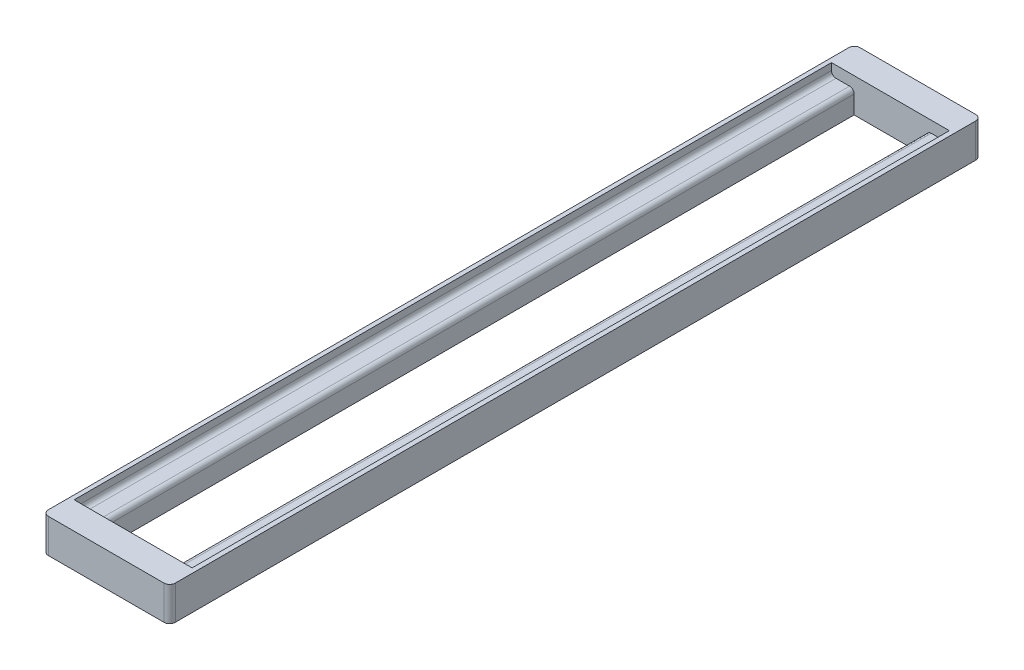
ISO-10303-21;
HEADER;
FILE_DESCRIPTION(('STEP AP214'),'2;1');
FILE_NAME('part.step','',(''),(''),'','','');
FILE_SCHEMA(('AUTOMOTIVE_DESIGN { 1 0 10303 214 1 1 1 1 }'));
ENDSEC;
DATA;
#1=APPLICATION_CONTEXT('core data for automotive mechanical design processes');
#2=APPLICATION_PROTOCOL_DEFINITION('international standard','automotive_design',2000,#1);
#3=PRODUCT_CONTEXT('',#1,'mechanical');
#4=PRODUCT('Part','Part','',(#3));
#5=PRODUCT_RELATED_PRODUCT_CATEGORY('part','',(#4));
#6=PRODUCT_DEFINITION_FORMATION('','',#4);
#7=PRODUCT_DEFINITION_CONTEXT('part definition',#1,'design');
#8=PRODUCT_DEFINITION('design','',#6,#7);
#9=PRODUCT_DEFINITION_SHAPE('','',#8);
#10=(LENGTH_UNIT() NAMED_UNIT(*) SI_UNIT(.MILLI.,.METRE.));
#11=(NAMED_UNIT(*) PLANE_ANGLE_UNIT() SI_UNIT($,.RADIAN.));
#12=(NAMED_UNIT(*) SI_UNIT($,.STERADIAN.) SOLID_ANGLE_UNIT());
#13=UNCERTAINTY_MEASURE_WITH_UNIT(LENGTH_MEASURE(1.E-05),#10,'distance_accuracy_value','');
#14=(GEOMETRIC_REPRESENTATION_CONTEXT(3) GLOBAL_UNCERTAINTY_ASSIGNED_CONTEXT((#13)) GLOBAL_UNIT_ASSIGNED_CONTEXT((#10,
#11,#12)) REPRESENTATION_CONTEXT('',''));
#15=CARTESIAN_POINT('',(0.,0.,0.));
#16=DIRECTION('',(0.,0.,1.));
#17=DIRECTION('',(1.,0.,0.));
#18=AXIS2_PLACEMENT_3D('',#15,#16,#17);
#19=CARTESIAN_POINT('',(59.1566,-0.762,-91.8329099518722));
#20=DIRECTION('',(0.,0.,1.));
#21=DIRECTION('',(1.,0.,0.));
#22=AXIS2_PLACEMENT_3D('',#19,#20,#21);
#23=CYLINDRICAL_SURFACE('',#22,0.508);
#24=CARTESIAN_POINT('',(59.1566,-0.762,-91.694));
#25=DIRECTION('',(0.,0.,1.));
#26=DIRECTION('',(1.,0.,0.));
#27=AXIS2_PLACEMENT_3D('',#24,#25,#26);
#28=CIRCLE('',#27,0.508);
#29=CARTESIAN_POINT('',(59.1566,-1.27,-91.694));
#30=VERTEX_POINT('',#29);
#31=CARTESIAN_POINT('',(59.6646,-0.762,-91.694));
#32=VERTEX_POINT('',#31);
#33=EDGE_CURVE('E159',#30,#32,#28,.T.);
#34=ORIENTED_EDGE('',*,*,#33,.F.);
#35=DIRECTION('',(0.,0.,1.));
#36=VECTOR('',#35,1.);
#37=CARTESIAN_POINT('',(59.1566,-1.27,-94.742));
#38=LINE('',#37,#36);
#39=CARTESIAN_POINT('',(59.1566,-1.27,-6.858));
#40=VERTEX_POINT('',#39);
#41=EDGE_CURVE('E156',#40,#30,#38,.F.);
#42=ORIENTED_EDGE('',*,*,#41,.F.);
#43=CARTESIAN_POINT('',(59.1566,-0.762,-6.858));
#44=DIRECTION('',(0.,0.,1.));
#45=DIRECTION('',(1.,0.,0.));
#46=AXIS2_PLACEMENT_3D('',#43,#44,#45);
#47=CIRCLE('',#46,0.508);
#48=CARTESIAN_POINT('',(59.6646,-0.762,-6.858));
#49=VERTEX_POINT('',#48);
#50=EDGE_CURVE('E19',#49,#40,#47,.F.);
#51=ORIENTED_EDGE('',*,*,#50,.F.);
#52=DIRECTION('',(0.,0.,-1.));
#53=VECTOR('',#52,1.);
#54=CARTESIAN_POINT('',(59.6646,-0.762,-6.858));
#55=LINE('',#54,#53);
#56=EDGE_CURVE('E153',#49,#32,#55,.T.);
#57=ORIENTED_EDGE('',*,*,#56,.T.);
#58=EDGE_LOOP('',(#34,#42,#51,#57));
#59=FACE_BOUND('',#58,.T.);
#60=ADVANCED_FACE('F16',(#59),#23,.F.);
#61=CARTESIAN_POINT('',(46.9646,-0.762,-6.71386171938712));
#62=DIRECTION('',(0.,0.,-1.));
#63=DIRECTION('',(-1.,0.,0.));
#64=AXIS2_PLACEMENT_3D('',#61,#62,#63);
#65=CYLINDRICAL_SURFACE('',#64,0.508);
#66=CARTESIAN_POINT('',(46.9646,-0.762,-6.858));
#67=DIRECTION('',(0.,0.,-1.));
#68=DIRECTION('',(-1.,0.,0.));
#69=AXIS2_PLACEMENT_3D('',#66,#67,#68);
#70=CIRCLE('',#69,0.508);
#71=CARTESIAN_POINT('',(46.9646,-1.27,-6.858));
#72=VERTEX_POINT('',#71);
#73=CARTESIAN_POINT('',(46.4566,-0.762,-6.858));
#74=VERTEX_POINT('',#73);
#75=EDGE_CURVE('E227',#72,#74,#70,.T.);
#76=ORIENTED_EDGE('',*,*,#75,.F.);
#77=DIRECTION('',(0.,0.,1.));
#78=VECTOR('',#77,1.);
#79=CARTESIAN_POINT('',(46.9646,-1.27,-94.742));
#80=LINE('',#79,#78);
#81=CARTESIAN_POINT('',(46.9646,-1.27,-91.694));
#82=VERTEX_POINT('',#81);
#83=EDGE_CURVE('E176',#82,#72,#80,.T.);
#84=ORIENTED_EDGE('',*,*,#83,.F.);
#85=CARTESIAN_POINT('',(46.9646,-0.762,-91.694));
#86=DIRECTION('',(0.,0.,-1.));
#87=DIRECTION('',(-1.,0.,0.));
#88=AXIS2_PLACEMENT_3D('',#85,#86,#87);
#89=CIRCLE('',#88,0.508);
#90=CARTESIAN_POINT('',(46.4566,-0.762,-91.694));
#91=VERTEX_POINT('',#90);
#92=EDGE_CURVE('E229',#91,#82,#89,.F.);
#93=ORIENTED_EDGE('',*,*,#92,.F.);
#94=DIRECTION('',(0.,0.,1.));
#95=VECTOR('',#94,1.);
#96=CARTESIAN_POINT('',(46.4566,-0.762,-91.694));
#97=LINE('',#96,#95);
#98=EDGE_CURVE('E168',#91,#74,#97,.T.);
#99=ORIENTED_EDGE('',*,*,#98,.T.);
#100=EDGE_LOOP('',(#76,#84,#93,#99));
#101=FACE_BOUND('',#100,.T.);
#102=ADVANCED_FACE('F347',(#101),#65,.F.);
#103=CARTESIAN_POINT('',(45.974,-1.27,-94.742));
#104=DIRECTION('',(0.,1.,0.));
#105=DIRECTION('',(0.,0.,1.));
#106=AXIS2_PLACEMENT_3D('',#103,#104,#105);
#107=PLANE('',#106);
#108=DIRECTION('',(1.,0.,0.));
#109=VECTOR('',#108,1.);
#110=CARTESIAN_POINT('',(45.974,-1.27,-91.694));
#111=LINE('',#110,#109);
#112=CARTESIAN_POINT('',(57.6326,-1.27,-91.694));
#113=VERTEX_POINT('',#112);
#114=EDGE_CURVE('E196',#30,#113,#111,.F.);
#115=ORIENTED_EDGE('',*,*,#114,.T.);
#116=DIRECTION('',(0.,0.,-1.));
#117=VECTOR('',#116,1.);
#118=CARTESIAN_POINT('',(57.6326,-1.27,-6.70952872812932));
#119=LINE('',#118,#117);
#120=CARTESIAN_POINT('',(57.6326,-1.27,-6.858));
#121=VERTEX_POINT('',#120);
#122=EDGE_CURVE('E212',#121,#113,#119,.T.);
#123=ORIENTED_EDGE('',*,*,#122,.F.);
#124=DIRECTION('',(1.,0.,0.));
#125=VECTOR('',#124,1.);
#126=CARTESIAN_POINT('',(45.974,-1.27,-6.858));
#127=LINE('',#126,#125);
#128=EDGE_CURVE('E197',#121,#40,#127,.T.);
#129=ORIENTED_EDGE('',*,*,#128,.T.);
#130=ORIENTED_EDGE('',*,*,#41,.T.);
#131=EDGE_LOOP('',(#115,#123,#129,#130));
#132=FACE_BOUND('',#131,.T.);
#133=ADVANCED_FACE('F240',(#132),#107,.T.);
#134=CARTESIAN_POINT('',(45.974,-1.27,-94.742));
#135=DIRECTION('',(0.,1.,0.));
#136=DIRECTION('',(0.,0.,1.));
#137=AXIS2_PLACEMENT_3D('',#134,#135,#136);
#138=PLANE('',#137);
#139=DIRECTION('',(1.,0.,0.));
#140=VECTOR('',#139,1.);
#141=CARTESIAN_POINT('',(45.974,-1.27,-6.858));
#142=LINE('',#141,#140);
#143=CARTESIAN_POINT('',(48.4886,-1.27,-6.858));
#144=VERTEX_POINT('',#143);
#145=EDGE_CURVE('E172',#72,#144,#142,.T.);
#146=ORIENTED_EDGE('',*,*,#145,.T.);
#147=DIRECTION('',(0.,0.,1.));
#148=VECTOR('',#147,1.);
#149=CARTESIAN_POINT('',(48.4886,-1.27,-91.8171586443604));
#150=LINE('',#149,#148);
#151=CARTESIAN_POINT('',(48.4886,-1.27,-91.694));
#152=VERTEX_POINT('',#151);
#153=EDGE_CURVE('E209',#152,#144,#150,.T.);
#154=ORIENTED_EDGE('',*,*,#153,.F.);
#155=DIRECTION('',(1.,0.,0.));
#156=VECTOR('',#155,1.);
#157=CARTESIAN_POINT('',(45.974,-1.27,-91.694));
#158=LINE('',#157,#156);
#159=EDGE_CURVE('E194',#152,#82,#158,.F.);
#160=ORIENTED_EDGE('',*,*,#159,.T.);
#161=ORIENTED_EDGE('',*,*,#83,.T.);
#162=EDGE_LOOP('',(#146,#154,#160,#161));
#163=FACE_BOUND('',#162,.T.);
#164=ADVANCED_FACE('F341',(#163),#138,.T.);
#165=CARTESIAN_POINT('',(59.6646,0.,-6.858));
#166=DIRECTION('',(1.,0.,0.));
#167=DIRECTION('',(0.,0.,-1.));
#168=AXIS2_PLACEMENT_3D('',#165,#166,#167);
#169=PLANE('',#168);
#170=DIRECTION('',(0.,0.,-1.));
#171=VECTOR('',#170,1.);
#172=CARTESIAN_POINT('',(59.6646,0.,-6.858));
#173=LINE('',#172,#171);
#174=CARTESIAN_POINT('',(59.6646,0.,-6.858));
#175=VERTEX_POINT('',#174);
#176=CARTESIAN_POINT('',(59.6646,0.,-91.694));
#177=VERTEX_POINT('',#176);
#178=EDGE_CURVE('E184',#175,#177,#173,.T.);
#179=ORIENTED_EDGE('',*,*,#178,.T.);
#180=DIRECTION('',(0.,1.,0.));
#181=VECTOR('',#180,1.);
#182=CARTESIAN_POINT('',(59.6646,0.,-91.694));
#183=LINE('',#182,#181);
#184=EDGE_CURVE('E169',#32,#177,#183,.T.);
#185=ORIENTED_EDGE('',*,*,#184,.F.);
#186=ORIENTED_EDGE('',*,*,#56,.F.);
#187=DIRECTION('',(0.,1.,0.));
#188=VECTOR('',#187,1.);
#189=CARTESIAN_POINT('',(59.6646,0.,-6.858));
#190=LINE('',#189,#188);
#191=EDGE_CURVE('E161',#175,#49,#190,.F.);
#192=ORIENTED_EDGE('',*,*,#191,.F.);
#193=EDGE_LOOP('',(#179,#185,#186,#192));
#194=FACE_BOUND('',#193,.T.);
#195=ADVANCED_FACE('F171',(#194),#169,.F.);
#196=CARTESIAN_POINT('',(46.4566,0.,-91.694));
#197=DIRECTION('',(-1.,0.,0.));
#198=DIRECTION('',(0.,0.,1.));
#199=AXIS2_PLACEMENT_3D('',#196,#197,#198);
#200=PLANE('',#199);
#201=DIRECTION('',(0.,0.,-1.));
#202=VECTOR('',#201,1.);
#203=CARTESIAN_POINT('',(46.4566,0.,-6.858));
#204=LINE('',#203,#202);
#205=CARTESIAN_POINT('',(46.4566,0.,-91.694));
#206=VERTEX_POINT('',#205);
#207=CARTESIAN_POINT('',(46.4566,0.,-6.858));
#208=VERTEX_POINT('',#207);
#209=EDGE_CURVE('E186',#206,#208,#204,.F.);
#210=ORIENTED_EDGE('',*,*,#209,.T.);
#211=DIRECTION('',(0.,1.,0.));
#212=VECTOR('',#211,1.);
#213=CARTESIAN_POINT('',(46.4566,0.,-6.858));
#214=LINE('',#213,#212);
#215=EDGE_CURVE('E246',#74,#208,#214,.T.);
#216=ORIENTED_EDGE('',*,*,#215,.F.);
#217=ORIENTED_EDGE('',*,*,#98,.F.);
#218=DIRECTION('',(0.,1.,0.));
#219=VECTOR('',#218,1.);
#220=CARTESIAN_POINT('',(46.4566,0.,-91.694));
#221=LINE('',#220,#219);
#222=EDGE_CURVE('E226',#206,#91,#221,.F.);
#223=ORIENTED_EDGE('',*,*,#222,.F.);
#224=EDGE_LOOP('',(#210,#216,#217,#223));
#225=FACE_BOUND('',#224,.T.);
#226=ADVANCED_FACE('F445',(#225),#200,.F.);
#227=CARTESIAN_POINT('',(59.563,-3.95413828061288,-4.445));
#228=DIRECTION('',(0.,1.,0.));
#229=DIRECTION('',(0.,0.,1.));
#230=AXIS2_PLACEMENT_3D('',#227,#228,#229);
#231=CYLINDRICAL_SURFACE('',#230,0.635);
#232=DIRECTION('',(0.,1.,0.));
#233=VECTOR('',#232,1.);
#234=CARTESIAN_POINT('',(60.198,0.,-4.445));
#235=LINE('',#234,#233);
#236=CARTESIAN_POINT('',(60.198,0.,-4.445));
#237=VERTEX_POINT('',#236);
#238=CARTESIAN_POINT('',(60.198,-3.81,-4.445));
#239=VERTEX_POINT('',#238);
#240=EDGE_CURVE('E302',#237,#239,#235,.F.);
#241=ORIENTED_EDGE('',*,*,#240,.F.);
#242=CARTESIAN_POINT('',(59.563,0.,-4.445));
#243=DIRECTION('',(0.,1.,0.));
#244=DIRECTION('',(0.,0.,1.));
#245=AXIS2_PLACEMENT_3D('',#242,#243,#244);
#246=CIRCLE('',#245,0.635);
#247=CARTESIAN_POINT('',(59.563,0.,-3.81));
#248=VERTEX_POINT('',#247);
#249=EDGE_CURVE('E205',#237,#248,#246,.F.);
#250=ORIENTED_EDGE('',*,*,#249,.T.);
#251=DIRECTION('',(0.,1.,0.));
#252=VECTOR('',#251,1.);
#253=CARTESIAN_POINT('',(59.563,0.,-3.81));
#254=LINE('',#253,#252);
#255=CARTESIAN_POINT('',(59.563,-3.81,-3.81));
#256=VERTEX_POINT('',#255);
#257=EDGE_CURVE('E293',#256,#248,#254,.T.);
#258=ORIENTED_EDGE('',*,*,#257,.F.);
#259=CARTESIAN_POINT('',(59.563,-3.81,-4.445));
#260=DIRECTION('',(0.,1.,0.));
#261=DIRECTION('',(0.,0.,1.));
#262=AXIS2_PLACEMENT_3D('',#259,#260,#261);
#263=CIRCLE('',#262,0.635);
#264=EDGE_CURVE('E224',#256,#239,#263,.T.);
#265=ORIENTED_EDGE('',*,*,#264,.T.);
#266=EDGE_LOOP('',(#241,#250,#258,#265));
#267=FACE_BOUND('',#266,.T.);
#268=ADVANCED_FACE('F433',(#267),#231,.T.);
#269=CARTESIAN_POINT('',(46.609,-3.95413828061288,-4.445));
#270=DIRECTION('',(0.,1.,0.));
#271=DIRECTION('',(0.,0.,1.));
#272=AXIS2_PLACEMENT_3D('',#269,#270,#271);
#273=CYLINDRICAL_SURFACE('',#272,0.635);
#274=DIRECTION('',(0.,1.,0.));
#275=VECTOR('',#274,1.);
#276=CARTESIAN_POINT('',(46.609,0.,-3.81));
#277=LINE('',#276,#275);
#278=CARTESIAN_POINT('',(46.609,0.,-3.81));
#279=VERTEX_POINT('',#278);
#280=CARTESIAN_POINT('',(46.609,-3.81,-3.81));
#281=VERTEX_POINT('',#280);
#282=EDGE_CURVE('E290',#279,#281,#277,.F.);
#283=ORIENTED_EDGE('',*,*,#282,.F.);
#284=CARTESIAN_POINT('',(46.609,0.,-4.445));
#285=DIRECTION('',(0.,1.,0.));
#286=DIRECTION('',(0.,0.,1.));
#287=AXIS2_PLACEMENT_3D('',#284,#285,#286);
#288=CIRCLE('',#287,0.635);
#289=CARTESIAN_POINT('',(45.974,0.,-4.445));
#290=VERTEX_POINT('',#289);
#291=EDGE_CURVE('E203',#279,#290,#288,.F.);
#292=ORIENTED_EDGE('',*,*,#291,.T.);
#293=DIRECTION('',(0.,1.,0.));
#294=VECTOR('',#293,1.);
#295=CARTESIAN_POINT('',(45.974,0.,-4.445));
#296=LINE('',#295,#294);
#297=CARTESIAN_POINT('',(45.974,-3.81,-4.445));
#298=VERTEX_POINT('',#297);
#299=EDGE_CURVE('E286',#298,#290,#296,.T.);
#300=ORIENTED_EDGE('',*,*,#299,.F.);
#301=CARTESIAN_POINT('',(46.609,-3.81,-4.445));
#302=DIRECTION('',(0.,1.,0.));
#303=DIRECTION('',(0.,0.,1.));
#304=AXIS2_PLACEMENT_3D('',#301,#302,#303);
#305=CIRCLE('',#304,0.635);
#306=EDGE_CURVE('E222',#298,#281,#305,.T.);
#307=ORIENTED_EDGE('',*,*,#306,.T.);
#308=EDGE_LOOP('',(#283,#292,#300,#307));
#309=FACE_BOUND('',#308,.T.);
#310=ADVANCED_FACE('F424',(#309),#273,.T.);
#311=CARTESIAN_POINT('',(46.609,-3.95413828061288,-94.107));
#312=DIRECTION('',(0.,1.,0.));
#313=DIRECTION('',(0.,0.,1.));
#314=AXIS2_PLACEMENT_3D('',#311,#312,#313);
#315=CYLINDRICAL_SURFACE('',#314,0.635);
#316=DIRECTION('',(0.,1.,0.));
#317=VECTOR('',#316,1.);
#318=CARTESIAN_POINT('',(45.974,0.,-94.107));
#319=LINE('',#318,#317);
#320=CARTESIAN_POINT('',(45.974,0.,-94.107));
#321=VERTEX_POINT('',#320);
#322=CARTESIAN_POINT('',(45.974,-3.81,-94.107));
#323=VERTEX_POINT('',#322);
#324=EDGE_CURVE('E282',#321,#323,#319,.F.);
#325=ORIENTED_EDGE('',*,*,#324,.F.);
#326=CARTESIAN_POINT('',(46.609,0.,-94.107));
#327=DIRECTION('',(0.,1.,0.));
#328=DIRECTION('',(0.,0.,1.));
#329=AXIS2_PLACEMENT_3D('',#326,#327,#328);
#330=CIRCLE('',#329,0.635);
#331=CARTESIAN_POINT('',(46.609,0.,-94.742));
#332=VERTEX_POINT('',#331);
#333=EDGE_CURVE('E187',#321,#332,#330,.F.);
#334=ORIENTED_EDGE('',*,*,#333,.T.);
#335=DIRECTION('',(0.,1.,0.));
#336=VECTOR('',#335,1.);
#337=CARTESIAN_POINT('',(46.609,0.,-94.742));
#338=LINE('',#337,#336);
#339=CARTESIAN_POINT('',(46.609,-3.81,-94.742));
#340=VERTEX_POINT('',#339);
#341=EDGE_CURVE('E278',#340,#332,#338,.T.);
#342=ORIENTED_EDGE('',*,*,#341,.F.);
#343=CARTESIAN_POINT('',(46.609,-3.81,-94.107));
#344=DIRECTION('',(0.,1.,0.));
#345=DIRECTION('',(0.,0.,1.));
#346=AXIS2_PLACEMENT_3D('',#343,#344,#345);
#347=CIRCLE('',#346,0.635);
#348=EDGE_CURVE('E220',#340,#323,#347,.T.);
#349=ORIENTED_EDGE('',*,*,#348,.T.);
#350=EDGE_LOOP('',(#325,#334,#342,#349));
#351=FACE_BOUND('',#350,.T.);
#352=ADVANCED_FACE('F374',(#351),#315,.T.);
#353=CARTESIAN_POINT('',(59.563,-3.95413828061288,-94.107));
#354=DIRECTION('',(0.,1.,0.));
#355=DIRECTION('',(0.,0.,1.));
#356=AXIS2_PLACEMENT_3D('',#353,#354,#355);
#357=CYLINDRICAL_SURFACE('',#356,0.635);
#358=DIRECTION('',(0.,1.,0.));
#359=VECTOR('',#358,1.);
#360=CARTESIAN_POINT('',(59.563,0.,-94.742));
#361=LINE('',#360,#359);
#362=CARTESIAN_POINT('',(59.563,0.,-94.742));
#363=VERTEX_POINT('',#362);
#364=CARTESIAN_POINT('',(59.563,-3.81,-94.742));
#365=VERTEX_POINT('',#364);
#366=EDGE_CURVE('E283',#363,#365,#361,.F.);
#367=ORIENTED_EDGE('',*,*,#366,.F.);
#368=CARTESIAN_POINT('',(59.563,0.,-94.107));
#369=DIRECTION('',(0.,1.,0.));
#370=DIRECTION('',(0.,0.,1.));
#371=AXIS2_PLACEMENT_3D('',#368,#369,#370);
#372=CIRCLE('',#371,0.635);
#373=CARTESIAN_POINT('',(60.198,0.,-94.107));
#374=VERTEX_POINT('',#373);
#375=EDGE_CURVE('E207',#363,#374,#372,.F.);
#376=ORIENTED_EDGE('',*,*,#375,.T.);
#377=DIRECTION('',(0.,1.,0.));
#378=VECTOR('',#377,1.);
#379=CARTESIAN_POINT('',(60.198,0.,-94.107));
#380=LINE('',#379,#378);
#381=CARTESIAN_POINT('',(60.198,-3.81,-94.107));
#382=VERTEX_POINT('',#381);
#383=EDGE_CURVE('E297',#382,#374,#380,.T.);
#384=ORIENTED_EDGE('',*,*,#383,.F.);
#385=CARTESIAN_POINT('',(59.563,-3.81,-94.107));
#386=DIRECTION('',(0.,1.,0.));
#387=DIRECTION('',(0.,0.,1.));
#388=AXIS2_PLACEMENT_3D('',#385,#386,#387);
#389=CIRCLE('',#388,0.635);
#390=EDGE_CURVE('E218',#382,#365,#389,.T.);
#391=ORIENTED_EDGE('',*,*,#390,.T.);
#392=EDGE_LOOP('',(#367,#376,#384,#391));
#393=FACE_BOUND('',#392,.T.);
#394=ADVANCED_FACE('F365',(#393),#357,.T.);
#395=CARTESIAN_POINT('',(57.6326,-1.778,-6.70952872812932));
#396=DIRECTION('',(0.,0.,-1.));
#397=DIRECTION('',(-1.,0.,0.));
#398=AXIS2_PLACEMENT_3D('',#395,#396,#397);
#399=CYLINDRICAL_SURFACE('',#398,0.508);
#400=CARTESIAN_POINT('',(57.6326,-1.778,-6.858));
#401=DIRECTION('',(0.,0.,-1.));
#402=DIRECTION('',(-1.,0.,0.));
#403=AXIS2_PLACEMENT_3D('',#400,#401,#402);
#404=CIRCLE('',#403,0.508);
#405=CARTESIAN_POINT('',(57.1246,-1.778,-6.858));
#406=VERTEX_POINT('',#405);
#407=EDGE_CURVE('E213',#406,#121,#404,.T.);
#408=ORIENTED_EDGE('',*,*,#407,.T.);
#409=ORIENTED_EDGE('',*,*,#122,.T.);
#410=CARTESIAN_POINT('',(57.6326,-1.778,-91.694));
#411=DIRECTION('',(0.,0.,-1.));
#412=DIRECTION('',(-1.,0.,0.));
#413=AXIS2_PLACEMENT_3D('',#410,#411,#412);
#414=CIRCLE('',#413,0.508);
#415=CARTESIAN_POINT('',(57.1246,-1.778,-91.694));
#416=VERTEX_POINT('',#415);
#417=EDGE_CURVE('E216',#113,#416,#414,.F.);
#418=ORIENTED_EDGE('',*,*,#417,.T.);
#419=DIRECTION('',(0.,0.,1.));
#420=VECTOR('',#419,1.);
#421=CARTESIAN_POINT('',(57.1246,-1.778,-6.858));
#422=LINE('',#421,#420);
#423=EDGE_CURVE('E257',#406,#416,#422,.F.);
#424=ORIENTED_EDGE('',*,*,#423,.F.);
#425=EDGE_LOOP('',(#408,#409,#418,#424));
#426=FACE_BOUND('',#425,.T.);
#427=ADVANCED_FACE('F363',(#426),#399,.T.);
#428=CARTESIAN_POINT('',(48.4886,-1.778,-91.8171586443604));
#429=DIRECTION('',(0.,0.,1.));
#430=DIRECTION('',(1.,0.,0.));
#431=AXIS2_PLACEMENT_3D('',#428,#429,#430);
#432=CYLINDRICAL_SURFACE('',#431,0.508);
#433=CARTESIAN_POINT('',(48.4886,-1.778,-91.694));
#434=DIRECTION('',(0.,0.,1.));
#435=DIRECTION('',(1.,0.,0.));
#436=AXIS2_PLACEMENT_3D('',#433,#434,#435);
#437=CIRCLE('',#436,0.508);
#438=CARTESIAN_POINT('',(48.9966,-1.778,-91.694));
#439=VERTEX_POINT('',#438);
#440=EDGE_CURVE('E198',#152,#439,#437,.F.);
#441=ORIENTED_EDGE('',*,*,#440,.F.);
#442=ORIENTED_EDGE('',*,*,#153,.T.);
#443=CARTESIAN_POINT('',(48.4886,-1.778,-6.858));
#444=DIRECTION('',(0.,0.,1.));
#445=DIRECTION('',(1.,0.,0.));
#446=AXIS2_PLACEMENT_3D('',#443,#444,#445);
#447=CIRCLE('',#446,0.508);
#448=CARTESIAN_POINT('',(48.9966,-1.778,-6.858));
#449=VERTEX_POINT('',#448);
#450=EDGE_CURVE('E210',#144,#449,#447,.F.);
#451=ORIENTED_EDGE('',*,*,#450,.T.);
#452=DIRECTION('',(0.,0.,-1.));
#453=VECTOR('',#452,1.);
#454=CARTESIAN_POINT('',(48.9966,-1.778,-91.694));
#455=LINE('',#454,#453);
#456=EDGE_CURVE('E266',#439,#449,#455,.F.);
#457=ORIENTED_EDGE('',*,*,#456,.F.);
#458=EDGE_LOOP('',(#441,#442,#451,#457));
#459=FACE_BOUND('',#458,.T.);
#460=ADVANCED_FACE('F351',(#459),#432,.T.);
#461=CARTESIAN_POINT('',(51.0921,0.,-6.858));
#462=DIRECTION('',(0.,-1.,0.));
#463=DIRECTION('',(0.,0.,-1.));
#464=AXIS2_PLACEMENT_3D('',#461,#462,#463);
#465=PLANE('',#464);
#466=ORIENTED_EDGE('',*,*,#209,.F.);
#467=DIRECTION('',(1.,0.,0.));
#468=VECTOR('',#467,1.);
#469=CARTESIAN_POINT('',(57.1246,0.,-91.694));
#470=LINE('',#469,#468);
#471=EDGE_CURVE('E201',#177,#206,#470,.F.);
#472=ORIENTED_EDGE('',*,*,#471,.F.);
#473=ORIENTED_EDGE('',*,*,#178,.F.);
#474=DIRECTION('',(-1.,0.,0.));
#475=VECTOR('',#474,1.);
#476=CARTESIAN_POINT('',(48.9966,0.,-6.858));
#477=LINE('',#476,#475);
#478=EDGE_CURVE('E164',#208,#175,#477,.F.);
#479=ORIENTED_EDGE('',*,*,#478,.F.);
#480=EDGE_LOOP('',(#466,#472,#473,#479));
#481=FACE_BOUND('',#480,.T.);
#482=ORIENTED_EDGE('',*,*,#333,.F.);
#483=DIRECTION('',(0.,0.,1.));
#484=VECTOR('',#483,1.);
#485=CARTESIAN_POINT('',(45.974,0.,-3.81));
#486=LINE('',#485,#484);
#487=EDGE_CURVE('E289',#290,#321,#486,.F.);
#488=ORIENTED_EDGE('',*,*,#487,.F.);
#489=ORIENTED_EDGE('',*,*,#291,.F.);
#490=DIRECTION('',(1.,0.,0.));
#491=VECTOR('',#490,1.);
#492=CARTESIAN_POINT('',(60.198,0.,-3.81));
#493=LINE('',#492,#491);
#494=EDGE_CURVE('E296',#248,#279,#493,.F.);
#495=ORIENTED_EDGE('',*,*,#494,.F.);
#496=ORIENTED_EDGE('',*,*,#249,.F.);
#497=DIRECTION('',(0.,0.,-1.));
#498=VECTOR('',#497,1.);
#499=CARTESIAN_POINT('',(60.198,0.,-94.742));
#500=LINE('',#499,#498);
#501=EDGE_CURVE('E253',#374,#237,#500,.F.);
#502=ORIENTED_EDGE('',*,*,#501,.F.);
#503=ORIENTED_EDGE('',*,*,#375,.F.);
#504=DIRECTION('',(-1.,0.,0.));
#505=VECTOR('',#504,1.);
#506=CARTESIAN_POINT('',(45.974,0.,-94.742));
#507=LINE('',#506,#505);
#508=EDGE_CURVE('E281',#332,#363,#507,.F.);
#509=ORIENTED_EDGE('',*,*,#508,.F.);
#510=EDGE_LOOP('',(#482,#488,#489,#495,#496,#502,#503,#509));
#511=FACE_BOUND('',#510,.T.);
#512=ADVANCED_FACE('F372',(#481,#511),#465,.F.);
#513=CARTESIAN_POINT('',(60.198,0.,-94.742));
#514=DIRECTION('',(1.,0.,0.));
#515=DIRECTION('',(0.,0.,-1.));
#516=AXIS2_PLACEMENT_3D('',#513,#514,#515);
#517=PLANE('',#516);
#518=DIRECTION('',(0.,0.,-1.));
#519=VECTOR('',#518,1.);
#520=CARTESIAN_POINT('',(60.198,-3.81,-6.858));
#521=LINE('',#520,#519);
#522=EDGE_CURVE('E264',#382,#239,#521,.F.);
#523=ORIENTED_EDGE('',*,*,#522,.F.);
#524=ORIENTED_EDGE('',*,*,#383,.T.);
#525=ORIENTED_EDGE('',*,*,#501,.T.);
#526=ORIENTED_EDGE('',*,*,#240,.T.);
#527=EDGE_LOOP('',(#523,#524,#525,#526));
#528=FACE_BOUND('',#527,.T.);
#529=ADVANCED_FACE('F401',(#528),#517,.T.);
#530=CARTESIAN_POINT('',(60.198,0.,-3.81));
#531=DIRECTION('',(0.,0.,1.));
#532=DIRECTION('',(1.,0.,0.));
#533=AXIS2_PLACEMENT_3D('',#530,#531,#532);
#534=PLANE('',#533);
#535=ORIENTED_EDGE('',*,*,#494,.T.);
#536=ORIENTED_EDGE('',*,*,#282,.T.);
#537=DIRECTION('',(1.,0.,0.));
#538=VECTOR('',#537,1.);
#539=CARTESIAN_POINT('',(51.0921,-3.81,-3.81));
#540=LINE('',#539,#538);
#541=EDGE_CURVE('E431',#256,#281,#540,.F.);
#542=ORIENTED_EDGE('',*,*,#541,.F.);
#543=ORIENTED_EDGE('',*,*,#257,.T.);
#544=EDGE_LOOP('',(#535,#536,#542,#543));
#545=FACE_BOUND('',#544,.T.);
#546=ADVANCED_FACE('F397',(#545),#534,.T.);
#547=CARTESIAN_POINT('',(45.974,0.,-3.81));
#548=DIRECTION('',(-1.,0.,0.));
#549=DIRECTION('',(0.,0.,1.));
#550=AXIS2_PLACEMENT_3D('',#547,#548,#549);
#551=PLANE('',#550);
#552=ORIENTED_EDGE('',*,*,#487,.T.);
#553=ORIENTED_EDGE('',*,*,#324,.T.);
#554=DIRECTION('',(0.,0.,-1.));
#555=VECTOR('',#554,1.);
#556=CARTESIAN_POINT('',(45.974,-3.81,-6.858));
#557=LINE('',#556,#555);
#558=EDGE_CURVE('E421',#298,#323,#557,.T.);
#559=ORIENTED_EDGE('',*,*,#558,.F.);
#560=ORIENTED_EDGE('',*,*,#299,.T.);
#561=EDGE_LOOP('',(#552,#553,#559,#560));
#562=FACE_BOUND('',#561,.T.);
#563=ADVANCED_FACE('F393',(#562),#551,.T.);
#564=CARTESIAN_POINT('',(45.974,0.,-94.742));
#565=DIRECTION('',(0.,0.,-1.));
#566=DIRECTION('',(-1.,0.,0.));
#567=AXIS2_PLACEMENT_3D('',#564,#565,#566);
#568=PLANE('',#567);
#569=ORIENTED_EDGE('',*,*,#508,.T.);
#570=ORIENTED_EDGE('',*,*,#366,.T.);
#571=DIRECTION('',(1.,0.,0.));
#572=VECTOR('',#571,1.);
#573=CARTESIAN_POINT('',(51.0921,-3.81,-94.742));
#574=LINE('',#573,#572);
#575=EDGE_CURVE('E311',#340,#365,#574,.T.);
#576=ORIENTED_EDGE('',*,*,#575,.F.);
#577=ORIENTED_EDGE('',*,*,#341,.T.);
#578=EDGE_LOOP('',(#569,#570,#576,#577));
#579=FACE_BOUND('',#578,.T.);
#580=ADVANCED_FACE('F390',(#579),#568,.T.);
#581=CARTESIAN_POINT('',(57.1246,0.,-6.858));
#582=DIRECTION('',(-1.,0.,0.));
#583=DIRECTION('',(0.,0.,1.));
#584=AXIS2_PLACEMENT_3D('',#581,#582,#583);
#585=PLANE('',#584);
#586=DIRECTION('',(0.,1.,0.));
#587=VECTOR('',#586,1.);
#588=CARTESIAN_POINT('',(57.1246,0.,-6.858));
#589=LINE('',#588,#587);
#590=CARTESIAN_POINT('',(57.1246,-3.81,-6.858));
#591=VERTEX_POINT('',#590);
#592=EDGE_CURVE('E262',#406,#591,#589,.F.);
#593=ORIENTED_EDGE('',*,*,#592,.F.);
#594=ORIENTED_EDGE('',*,*,#423,.T.);
#595=DIRECTION('',(0.,1.,0.));
#596=VECTOR('',#595,1.);
#597=CARTESIAN_POINT('',(57.1246,0.,-91.694));
#598=LINE('',#597,#596);
#599=CARTESIAN_POINT('',(57.1246,-3.81,-91.694));
#600=VERTEX_POINT('',#599);
#601=EDGE_CURVE('E200',#600,#416,#598,.T.);
#602=ORIENTED_EDGE('',*,*,#601,.F.);
#603=DIRECTION('',(0.,0.,-1.));
#604=VECTOR('',#603,1.);
#605=CARTESIAN_POINT('',(57.1246,-3.81,-6.858));
#606=LINE('',#605,#604);
#607=EDGE_CURVE('E307',#591,#600,#606,.T.);
#608=ORIENTED_EDGE('',*,*,#607,.F.);
#609=EDGE_LOOP('',(#593,#594,#602,#608));
#610=FACE_BOUND('',#609,.T.);
#611=ADVANCED_FACE('F360',(#610),#585,.T.);
#612=CARTESIAN_POINT('',(57.1246,0.,-91.694));
#613=DIRECTION('',(0.,0.,1.));
#614=DIRECTION('',(1.,0.,0.));
#615=AXIS2_PLACEMENT_3D('',#612,#613,#614);
#616=PLANE('',#615);
#617=ORIENTED_EDGE('',*,*,#417,.F.);
#618=ORIENTED_EDGE('',*,*,#114,.F.);
#619=ORIENTED_EDGE('',*,*,#33,.T.);
#620=ORIENTED_EDGE('',*,*,#184,.T.);
#621=ORIENTED_EDGE('',*,*,#471,.T.);
#622=ORIENTED_EDGE('',*,*,#222,.T.);
#623=ORIENTED_EDGE('',*,*,#92,.T.);
#624=ORIENTED_EDGE('',*,*,#159,.F.);
#625=ORIENTED_EDGE('',*,*,#440,.T.);
#626=DIRECTION('',(0.,1.,0.));
#627=VECTOR('',#626,1.);
#628=CARTESIAN_POINT('',(48.9966,0.,-91.694));
#629=LINE('',#628,#627);
#630=CARTESIAN_POINT('',(48.9966,-3.81,-91.694));
#631=VERTEX_POINT('',#630);
#632=EDGE_CURVE('E268',#631,#439,#629,.T.);
#633=ORIENTED_EDGE('',*,*,#632,.F.);
#634=DIRECTION('',(1.,0.,0.));
#635=VECTOR('',#634,1.);
#636=CARTESIAN_POINT('',(51.0921,-3.81,-91.694));
#637=LINE('',#636,#635);
#638=EDGE_CURVE('E310',#600,#631,#637,.F.);
#639=ORIENTED_EDGE('',*,*,#638,.F.);
#640=ORIENTED_EDGE('',*,*,#601,.T.);
#641=EDGE_LOOP('',(#617,#618,#619,#620,#621,#622,#623,#624,#625,#633,#639,#640));
#642=FACE_BOUND('',#641,.T.);
#643=ADVANCED_FACE('F232',(#642),#616,.T.);
#644=CARTESIAN_POINT('',(48.9966,0.,-91.694));
#645=DIRECTION('',(1.,0.,0.));
#646=DIRECTION('',(0.,0.,-1.));
#647=AXIS2_PLACEMENT_3D('',#644,#645,#646);
#648=PLANE('',#647);
#649=ORIENTED_EDGE('',*,*,#632,.T.);
#650=ORIENTED_EDGE('',*,*,#456,.T.);
#651=DIRECTION('',(0.,1.,0.));
#652=VECTOR('',#651,1.);
#653=CARTESIAN_POINT('',(48.9966,0.,-6.858));
#654=LINE('',#653,#652);
#655=CARTESIAN_POINT('',(48.9966,-3.81,-6.858));
#656=VERTEX_POINT('',#655);
#657=EDGE_CURVE('E34',#656,#449,#654,.T.);
#658=ORIENTED_EDGE('',*,*,#657,.F.);
#659=DIRECTION('',(0.,0.,-1.));
#660=VECTOR('',#659,1.);
#661=CARTESIAN_POINT('',(48.9966,-3.81,-6.858));
#662=LINE('',#661,#660);
#663=EDGE_CURVE('E25',#631,#656,#662,.F.);
#664=ORIENTED_EDGE('',*,*,#663,.F.);
#665=EDGE_LOOP('',(#649,#650,#658,#664));
#666=FACE_BOUND('',#665,.T.);
#667=ADVANCED_FACE('F352',(#666),#648,.T.);
#668=CARTESIAN_POINT('',(48.9966,0.,-6.858));
#669=DIRECTION('',(0.,0.,-1.));
#670=DIRECTION('',(-1.,0.,0.));
#671=AXIS2_PLACEMENT_3D('',#668,#669,#670);
#672=PLANE('',#671);
#673=ORIENTED_EDGE('',*,*,#407,.F.);
#674=ORIENTED_EDGE('',*,*,#592,.T.);
#675=DIRECTION('',(1.,0.,0.));
#676=VECTOR('',#675,1.);
#677=CARTESIAN_POINT('',(51.0921,-3.81,-6.858));
#678=LINE('',#677,#676);
#679=EDGE_CURVE('E11',#656,#591,#678,.T.);
#680=ORIENTED_EDGE('',*,*,#679,.F.);
#681=ORIENTED_EDGE('',*,*,#657,.T.);
#682=ORIENTED_EDGE('',*,*,#450,.F.);
#683=ORIENTED_EDGE('',*,*,#145,.F.);
#684=ORIENTED_EDGE('',*,*,#75,.T.);
#685=ORIENTED_EDGE('',*,*,#215,.T.);
#686=ORIENTED_EDGE('',*,*,#478,.T.);
#687=ORIENTED_EDGE('',*,*,#191,.T.);
#688=ORIENTED_EDGE('',*,*,#50,.T.);
#689=ORIENTED_EDGE('',*,*,#128,.F.);
#690=EDGE_LOOP('',(#673,#674,#680,#681,#682,#683,#684,#685,#686,#687,#688,#689));
#691=FACE_BOUND('',#690,.T.);
#692=ADVANCED_FACE('F162',(#691),#672,.T.);
#693=CARTESIAN_POINT('',(51.0921,-3.81,-6.858));
#694=DIRECTION('',(0.,-1.,0.));
#695=DIRECTION('',(0.,0.,-1.));
#696=AXIS2_PLACEMENT_3D('',#693,#694,#695);
#697=PLANE('',#696);
#698=ORIENTED_EDGE('',*,*,#663,.T.);
#699=ORIENTED_EDGE('',*,*,#679,.T.);
#700=ORIENTED_EDGE('',*,*,#607,.T.);
#701=ORIENTED_EDGE('',*,*,#638,.T.);
#702=EDGE_LOOP('',(#698,#699,#700,#701));
#703=FACE_BOUND('',#702,.T.);
#704=ORIENTED_EDGE('',*,*,#575,.T.);
#705=ORIENTED_EDGE('',*,*,#390,.F.);
#706=ORIENTED_EDGE('',*,*,#522,.T.);
#707=ORIENTED_EDGE('',*,*,#264,.F.);
#708=ORIENTED_EDGE('',*,*,#541,.T.);
#709=ORIENTED_EDGE('',*,*,#306,.F.);
#710=ORIENTED_EDGE('',*,*,#558,.T.);
#711=ORIENTED_EDGE('',*,*,#348,.F.);
#712=EDGE_LOOP('',(#704,#705,#706,#707,#708,#709,#710,#711));
#713=FACE_BOUND('',#712,.T.);
#714=ADVANCED_FACE('F356',(#703,#713),#697,.T.);
#715=CLOSED_SHELL('',(#60,#102,#133,#164,#195,#226,#268,#310,#352,#394,#427,#460,#512,#529,#546,
#563,#580,#611,#643,#667,#692,#714));
#716=MANIFOLD_SOLID_BREP('B1',#715);
#717=ADVANCED_BREP_SHAPE_REPRESENTATION('',(#18,#716),#14);
#718=SHAPE_DEFINITION_REPRESENTATION(#9,#717);
ENDSEC;
END-ISO-10303-21;
